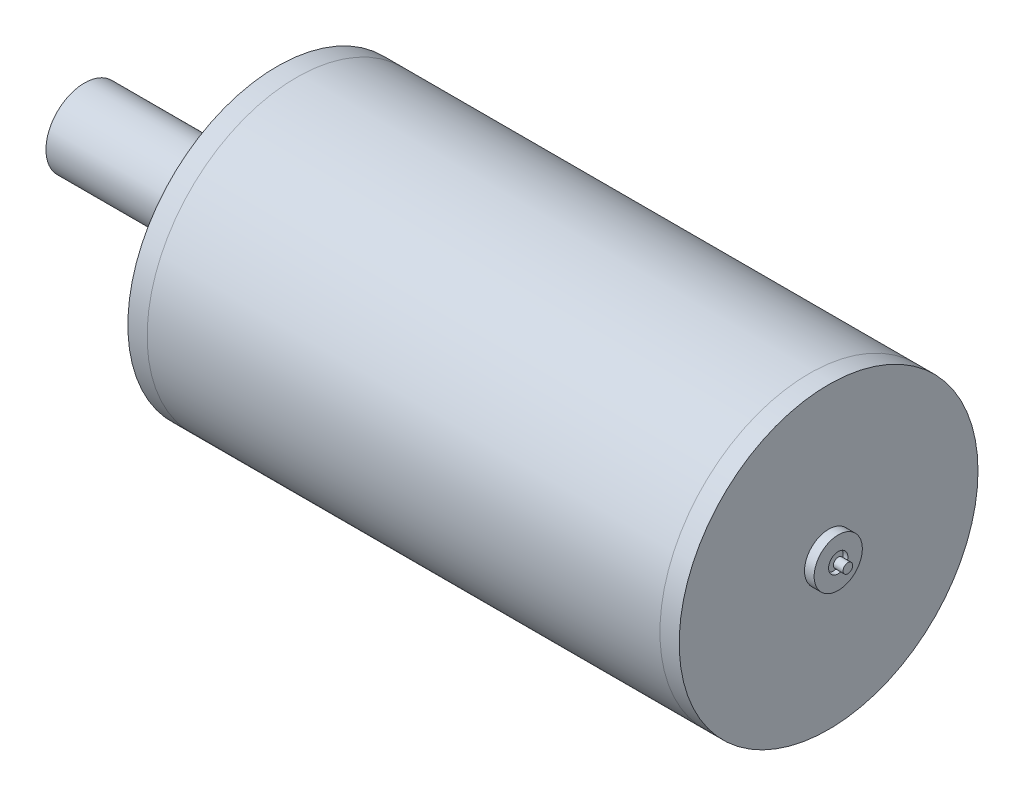
ISO-10303-21;
HEADER;
FILE_DESCRIPTION(('STEP AP214'),'2;1');
FILE_NAME('part.step','',(''),(''),'','','');
FILE_SCHEMA(('AUTOMOTIVE_DESIGN { 1 0 10303 214 1 1 1 1 }'));
ENDSEC;
DATA;
#1=APPLICATION_CONTEXT('core data for automotive mechanical design processes');
#2=APPLICATION_PROTOCOL_DEFINITION('international standard','automotive_design',2000,#1);
#3=PRODUCT_CONTEXT('',#1,'mechanical');
#4=PRODUCT('Part','Part','',(#3));
#5=PRODUCT_RELATED_PRODUCT_CATEGORY('part','',(#4));
#6=PRODUCT_DEFINITION_FORMATION('','',#4);
#7=PRODUCT_DEFINITION_CONTEXT('part definition',#1,'design');
#8=PRODUCT_DEFINITION('design','',#6,#7);
#9=PRODUCT_DEFINITION_SHAPE('','',#8);
#10=(LENGTH_UNIT() NAMED_UNIT(*) SI_UNIT(.MILLI.,.METRE.));
#11=(NAMED_UNIT(*) PLANE_ANGLE_UNIT() SI_UNIT($,.RADIAN.));
#12=(NAMED_UNIT(*) SI_UNIT($,.STERADIAN.) SOLID_ANGLE_UNIT());
#13=UNCERTAINTY_MEASURE_WITH_UNIT(LENGTH_MEASURE(1.E-05),#10,'distance_accuracy_value','');
#14=(GEOMETRIC_REPRESENTATION_CONTEXT(3) GLOBAL_UNCERTAINTY_ASSIGNED_CONTEXT((#13)) GLOBAL_UNIT_ASSIGNED_CONTEXT((#10,
#11,#12)) REPRESENTATION_CONTEXT('',''));
#15=CARTESIAN_POINT('',(0.,0.,0.));
#16=DIRECTION('',(0.,0.,1.));
#17=DIRECTION('',(1.,0.,0.));
#18=AXIS2_PLACEMENT_3D('',#15,#16,#17);
#19=CARTESIAN_POINT('',(59.2,0.,0.));
#20=DIRECTION('',(-1.,0.,0.));
#21=DIRECTION('',(0.,0.,1.));
#22=AXIS2_PLACEMENT_3D('',#19,#20,#21);
#23=CYLINDRICAL_SURFACE('',#22,0.5);
#24=CARTESIAN_POINT('',(59.2,0.,0.));
#25=DIRECTION('',(1.,0.,0.));
#26=DIRECTION('',(0.,0.,-1.));
#27=AXIS2_PLACEMENT_3D('',#24,#25,#26);
#28=CIRCLE('',#27,0.5);
#29=CARTESIAN_POINT('',(59.2,0.,-0.5));
#30=VERTEX_POINT('',#29);
#31=EDGE_CURVE('E11',#30,#30,#28,.T.);
#32=ORIENTED_EDGE('',*,*,#31,.F.);
#33=EDGE_LOOP('',(#32));
#34=FACE_BOUND('',#33,.T.);
#35=CARTESIAN_POINT('',(58.2,0.,0.));
#36=DIRECTION('',(1.,0.,0.));
#37=DIRECTION('',(0.,0.,-1.));
#38=AXIS2_PLACEMENT_3D('',#35,#36,#37);
#39=CIRCLE('',#38,0.5);
#40=CARTESIAN_POINT('',(58.2,0.,-0.5));
#41=VERTEX_POINT('',#40);
#42=EDGE_CURVE('E48',#41,#41,#39,.T.);
#43=ORIENTED_EDGE('',*,*,#42,.T.);
#44=EDGE_LOOP('',(#43));
#45=FACE_BOUND('',#44,.T.);
#46=ADVANCED_FACE('F45',(#34,#45),#23,.T.);
#47=CARTESIAN_POINT('',(59.2,0.,0.));
#48=DIRECTION('',(1.,0.,0.));
#49=DIRECTION('',(0.,0.,-1.));
#50=AXIS2_PLACEMENT_3D('',#47,#48,#49);
#51=PLANE('',#50);
#52=ORIENTED_EDGE('',*,*,#31,.T.);
#53=EDGE_LOOP('',(#52));
#54=FACE_BOUND('',#53,.T.);
#55=ADVANCED_FACE('F60',(#54),#51,.T.);
#56=CARTESIAN_POINT('',(58.2,0.,0.));
#57=DIRECTION('',(1.,0.,0.));
#58=DIRECTION('',(0.,0.,-1.));
#59=AXIS2_PLACEMENT_3D('',#56,#57,#58);
#60=PLANE('',#59);
#61=ORIENTED_EDGE('',*,*,#42,.F.);
#62=EDGE_LOOP('',(#61));
#63=FACE_BOUND('',#62,.T.);
#64=ADVANCED_FACE('F58',(#63),#60,.F.);
#65=CLOSED_SHELL('',(#46,#55,#64));
#66=MANIFOLD_SOLID_BREP('B2',#65);
#67=CARTESIAN_POINT('',(58.2,0.,0.));
#68=DIRECTION('',(-1.,0.,0.));
#69=DIRECTION('',(0.,0.,1.));
#70=AXIS2_PLACEMENT_3D('',#67,#68,#69);
#71=CYLINDRICAL_SURFACE('',#70,2.5);
#72=CARTESIAN_POINT('',(58.2,0.,0.));
#73=DIRECTION('',(1.,0.,0.));
#74=DIRECTION('',(0.,0.,-1.));
#75=AXIS2_PLACEMENT_3D('',#72,#73,#74);
#76=CIRCLE('',#75,2.5);
#77=CARTESIAN_POINT('',(58.2,0.,-2.5));
#78=VERTEX_POINT('',#77);
#79=EDGE_CURVE('E44',#78,#78,#76,.T.);
#80=ORIENTED_EDGE('',*,*,#79,.F.);
#81=EDGE_LOOP('',(#80));
#82=FACE_BOUND('',#81,.T.);
#83=CARTESIAN_POINT('',(57.2,0.,0.));
#84=DIRECTION('',(1.,0.,0.));
#85=DIRECTION('',(0.,0.,-1.));
#86=AXIS2_PLACEMENT_3D('',#83,#84,#85);
#87=CIRCLE('',#86,2.5);
#88=CARTESIAN_POINT('',(57.2,0.,-2.5));
#89=VERTEX_POINT('',#88);
#90=EDGE_CURVE('E96',#89,#89,#87,.T.);
#91=ORIENTED_EDGE('',*,*,#90,.T.);
#92=EDGE_LOOP('',(#91));
#93=FACE_BOUND('',#92,.T.);
#94=ADVANCED_FACE('F93',(#82,#93),#71,.T.);
#95=CARTESIAN_POINT('',(58.2,0.,0.));
#96=DIRECTION('',(1.,0.,0.));
#97=DIRECTION('',(0.,0.,-1.));
#98=AXIS2_PLACEMENT_3D('',#95,#96,#97);
#99=PLANE('',#98);
#100=CARTESIAN_POINT('',(58.2,0.,0.));
#101=DIRECTION('',(1.,0.,0.));
#102=DIRECTION('',(0.,0.,-1.));
#103=AXIS2_PLACEMENT_3D('',#100,#101,#102);
#104=CIRCLE('',#103,1.);
#105=CARTESIAN_POINT('',(58.2,0.,-1.));
#106=VERTEX_POINT('',#105);
#107=EDGE_CURVE('E105',#106,#106,#104,.T.);
#108=ORIENTED_EDGE('',*,*,#107,.F.);
#109=EDGE_LOOP('',(#108));
#110=FACE_BOUND('',#109,.T.);
#111=ORIENTED_EDGE('',*,*,#79,.T.);
#112=EDGE_LOOP('',(#111));
#113=FACE_BOUND('',#112,.T.);
#114=ADVANCED_FACE('F120',(#110,#113),#99,.T.);
#115=CARTESIAN_POINT('',(57.2,0.,0.));
#116=DIRECTION('',(1.,0.,0.));
#117=DIRECTION('',(0.,0.,-1.));
#118=AXIS2_PLACEMENT_3D('',#115,#116,#117);
#119=PLANE('',#118);
#120=ORIENTED_EDGE('',*,*,#90,.F.);
#121=EDGE_LOOP('',(#120));
#122=FACE_BOUND('',#121,.T.);
#123=ADVANCED_FACE('F116',(#122),#119,.F.);
#124=CARTESIAN_POINT('',(57.7,0.,0.));
#125=DIRECTION('',(1.,0.,0.));
#126=DIRECTION('',(0.,0.,-1.));
#127=AXIS2_PLACEMENT_3D('',#124,#125,#126);
#128=CYLINDRICAL_SURFACE('',#127,1.);
#129=CARTESIAN_POINT('',(57.7,0.,0.));
#130=DIRECTION('',(1.,0.,0.));
#131=DIRECTION('',(0.,0.,-1.));
#132=AXIS2_PLACEMENT_3D('',#129,#130,#131);
#133=CIRCLE('',#132,1.);
#134=CARTESIAN_POINT('',(57.7,0.,-1.));
#135=VERTEX_POINT('',#134);
#136=EDGE_CURVE('E103',#135,#135,#133,.T.);
#137=ORIENTED_EDGE('',*,*,#136,.F.);
#138=EDGE_LOOP('',(#137));
#139=FACE_BOUND('',#138,.T.);
#140=ORIENTED_EDGE('',*,*,#107,.T.);
#141=EDGE_LOOP('',(#140));
#142=FACE_BOUND('',#141,.T.);
#143=ADVANCED_FACE('F113',(#139,#142),#128,.F.);
#144=CARTESIAN_POINT('',(57.7,0.,0.));
#145=DIRECTION('',(1.,0.,0.));
#146=DIRECTION('',(0.,0.,-1.));
#147=AXIS2_PLACEMENT_3D('',#144,#145,#146);
#148=PLANE('',#147);
#149=ORIENTED_EDGE('',*,*,#136,.T.);
#150=EDGE_LOOP('',(#149));
#151=FACE_BOUND('',#150,.T.);
#152=ADVANCED_FACE('F111',(#151),#148,.T.);
#153=CLOSED_SHELL('',(#94,#114,#123,#143,#152));
#154=MANIFOLD_SOLID_BREP('B6',#153);
#155=CARTESIAN_POINT('',(57.2,0.,0.));
#156=DIRECTION('',(-1.,0.,0.));
#157=DIRECTION('',(0.,0.,1.));
#158=AXIS2_PLACEMENT_3D('',#155,#156,#157);
#159=CYLINDRICAL_SURFACE('',#158,15.5);
#160=CARTESIAN_POINT('',(57.2,0.,0.));
#161=DIRECTION('',(1.,0.,0.));
#162=DIRECTION('',(0.,0.,-1.));
#163=AXIS2_PLACEMENT_3D('',#160,#161,#162);
#164=CIRCLE('',#163,15.5);
#165=CARTESIAN_POINT('',(57.2,0.,-15.5));
#166=VERTEX_POINT('',#165);
#167=EDGE_CURVE('E92',#166,#166,#164,.T.);
#168=ORIENTED_EDGE('',*,*,#167,.F.);
#169=EDGE_LOOP('',(#168));
#170=FACE_BOUND('',#169,.T.);
#171=CARTESIAN_POINT('',(55.2,0.,0.));
#172=DIRECTION('',(1.,0.,0.));
#173=DIRECTION('',(0.,0.,-1.));
#174=AXIS2_PLACEMENT_3D('',#171,#172,#173);
#175=CIRCLE('',#174,15.5);
#176=CARTESIAN_POINT('',(55.2,0.,-15.5));
#177=VERTEX_POINT('',#176);
#178=EDGE_CURVE('E174',#177,#177,#175,.T.);
#179=ORIENTED_EDGE('',*,*,#178,.T.);
#180=EDGE_LOOP('',(#179));
#181=FACE_BOUND('',#180,.T.);
#182=ADVANCED_FACE('F171',(#170,#181),#159,.T.);
#183=CARTESIAN_POINT('',(57.2,0.,0.));
#184=DIRECTION('',(1.,0.,0.));
#185=DIRECTION('',(0.,0.,-1.));
#186=AXIS2_PLACEMENT_3D('',#183,#184,#185);
#187=PLANE('',#186);
#188=ORIENTED_EDGE('',*,*,#167,.T.);
#189=EDGE_LOOP('',(#188));
#190=FACE_BOUND('',#189,.T.);
#191=ADVANCED_FACE('F186',(#190),#187,.T.);
#192=CARTESIAN_POINT('',(55.2,0.,0.));
#193=DIRECTION('',(1.,0.,0.));
#194=DIRECTION('',(0.,0.,-1.));
#195=AXIS2_PLACEMENT_3D('',#192,#193,#194);
#196=PLANE('',#195);
#197=ORIENTED_EDGE('',*,*,#178,.F.);
#198=EDGE_LOOP('',(#197));
#199=FACE_BOUND('',#198,.T.);
#200=ADVANCED_FACE('F184',(#199),#196,.F.);
#201=CLOSED_SHELL('',(#182,#191,#200));
#202=MANIFOLD_SOLID_BREP('B39',#201);
#203=CARTESIAN_POINT('',(55.2,0.,0.));
#204=DIRECTION('',(-1.,0.,0.));
#205=DIRECTION('',(0.,0.,1.));
#206=AXIS2_PLACEMENT_3D('',#203,#204,#205);
#207=CYLINDRICAL_SURFACE('',#206,15.5);
#208=CARTESIAN_POINT('',(55.2,0.,0.));
#209=DIRECTION('',(1.,0.,0.));
#210=DIRECTION('',(0.,0.,-1.));
#211=AXIS2_PLACEMENT_3D('',#208,#209,#210);
#212=CIRCLE('',#211,15.5);
#213=CARTESIAN_POINT('',(55.2,0.,-15.5));
#214=VERTEX_POINT('',#213);
#215=EDGE_CURVE('E170',#214,#214,#212,.T.);
#216=ORIENTED_EDGE('',*,*,#215,.F.);
#217=EDGE_LOOP('',(#216));
#218=FACE_BOUND('',#217,.T.);
#219=CARTESIAN_POINT('',(2.,0.,0.));
#220=DIRECTION('',(1.,0.,0.));
#221=DIRECTION('',(0.,0.,-1.));
#222=AXIS2_PLACEMENT_3D('',#219,#220,#221);
#223=CIRCLE('',#222,15.5);
#224=CARTESIAN_POINT('',(2.,0.,-15.5));
#225=VERTEX_POINT('',#224);
#226=EDGE_CURVE('E221',#225,#225,#223,.T.);
#227=ORIENTED_EDGE('',*,*,#226,.T.);
#228=EDGE_LOOP('',(#227));
#229=FACE_BOUND('',#228,.T.);
#230=ADVANCED_FACE('F218',(#218,#229),#207,.T.);
#231=CARTESIAN_POINT('',(55.2,0.,0.));
#232=DIRECTION('',(1.,0.,0.));
#233=DIRECTION('',(0.,0.,-1.));
#234=AXIS2_PLACEMENT_3D('',#231,#232,#233);
#235=PLANE('',#234);
#236=ORIENTED_EDGE('',*,*,#215,.T.);
#237=EDGE_LOOP('',(#236));
#238=FACE_BOUND('',#237,.T.);
#239=ADVANCED_FACE('F233',(#238),#235,.T.);
#240=CARTESIAN_POINT('',(2.,0.,0.));
#241=DIRECTION('',(1.,0.,0.));
#242=DIRECTION('',(0.,0.,-1.));
#243=AXIS2_PLACEMENT_3D('',#240,#241,#242);
#244=PLANE('',#243);
#245=ORIENTED_EDGE('',*,*,#226,.F.);
#246=EDGE_LOOP('',(#245));
#247=FACE_BOUND('',#246,.T.);
#248=ADVANCED_FACE('F231',(#247),#244,.F.);
#249=CLOSED_SHELL('',(#230,#239,#248));
#250=MANIFOLD_SOLID_BREP('B87',#249);
#251=CARTESIAN_POINT('',(2.,0.,0.));
#252=DIRECTION('',(-1.,0.,0.));
#253=DIRECTION('',(0.,0.,1.));
#254=AXIS2_PLACEMENT_3D('',#251,#252,#253);
#255=CYLINDRICAL_SURFACE('',#254,15.5);
#256=CARTESIAN_POINT('',(2.,0.,0.));
#257=DIRECTION('',(1.,0.,0.));
#258=DIRECTION('',(0.,0.,-1.));
#259=AXIS2_PLACEMENT_3D('',#256,#257,#258);
#260=CIRCLE('',#259,15.5);
#261=CARTESIAN_POINT('',(2.,0.,-15.5));
#262=VERTEX_POINT('',#261);
#263=EDGE_CURVE('E217',#262,#262,#260,.T.);
#264=ORIENTED_EDGE('',*,*,#263,.F.);
#265=EDGE_LOOP('',(#264));
#266=FACE_BOUND('',#265,.T.);
#267=CARTESIAN_POINT('',(0.,0.,0.));
#268=DIRECTION('',(1.,0.,0.));
#269=DIRECTION('',(0.,0.,-1.));
#270=AXIS2_PLACEMENT_3D('',#267,#268,#269);
#271=CIRCLE('',#270,15.5);
#272=CARTESIAN_POINT('',(0.,0.,-15.5));
#273=VERTEX_POINT('',#272);
#274=EDGE_CURVE('E263',#273,#273,#271,.T.);
#275=ORIENTED_EDGE('',*,*,#274,.T.);
#276=EDGE_LOOP('',(#275));
#277=FACE_BOUND('',#276,.T.);
#278=ADVANCED_FACE('F260',(#266,#277),#255,.T.);
#279=CARTESIAN_POINT('',(2.,0.,0.));
#280=DIRECTION('',(1.,0.,0.));
#281=DIRECTION('',(0.,0.,-1.));
#282=AXIS2_PLACEMENT_3D('',#279,#280,#281);
#283=PLANE('',#282);
#284=ORIENTED_EDGE('',*,*,#263,.T.);
#285=EDGE_LOOP('',(#284));
#286=FACE_BOUND('',#285,.T.);
#287=ADVANCED_FACE('F290',(#286),#283,.T.);
#288=CARTESIAN_POINT('',(0.,0.,0.));
#289=DIRECTION('',(1.,0.,0.));
#290=DIRECTION('',(0.,0.,-1.));
#291=AXIS2_PLACEMENT_3D('',#288,#289,#290);
#292=PLANE('',#291);
#293=CARTESIAN_POINT('',(0.,0.,0.));
#294=DIRECTION('',(1.,0.,0.));
#295=DIRECTION('',(0.,0.,-1.));
#296=AXIS2_PLACEMENT_3D('',#293,#294,#295);
#297=CIRCLE('',#296,4.);
#298=CARTESIAN_POINT('',(0.,0.,-4.));
#299=VERTEX_POINT('',#298);
#300=EDGE_CURVE('E272',#299,#299,#297,.T.);
#301=ORIENTED_EDGE('',*,*,#300,.T.);
#302=EDGE_LOOP('',(#301));
#303=FACE_BOUND('',#302,.T.);
#304=ORIENTED_EDGE('',*,*,#274,.F.);
#305=EDGE_LOOP('',(#304));
#306=FACE_BOUND('',#305,.T.);
#307=ADVANCED_FACE('F287',(#303,#306),#292,.F.);
#308=CARTESIAN_POINT('',(-20.,0.,0.));
#309=DIRECTION('',(1.,0.,0.));
#310=DIRECTION('',(0.,0.,-1.));
#311=AXIS2_PLACEMENT_3D('',#308,#309,#310);
#312=CYLINDRICAL_SURFACE('',#311,4.);
#313=CARTESIAN_POINT('',(-20.,0.,0.));
#314=DIRECTION('',(1.,0.,0.));
#315=DIRECTION('',(0.,0.,-1.));
#316=AXIS2_PLACEMENT_3D('',#313,#314,#315);
#317=CIRCLE('',#316,4.);
#318=CARTESIAN_POINT('',(-20.,0.,-4.));
#319=VERTEX_POINT('',#318);
#320=EDGE_CURVE('E270',#319,#319,#317,.T.);
#321=ORIENTED_EDGE('',*,*,#320,.T.);
#322=EDGE_LOOP('',(#321));
#323=FACE_BOUND('',#322,.T.);
#324=ORIENTED_EDGE('',*,*,#300,.F.);
#325=EDGE_LOOP('',(#324));
#326=FACE_BOUND('',#325,.T.);
#327=ADVANCED_FACE('F278',(#323,#326),#312,.T.);
#328=CARTESIAN_POINT('',(-20.,0.,0.));
#329=DIRECTION('',(1.,0.,0.));
#330=DIRECTION('',(0.,0.,-1.));
#331=AXIS2_PLACEMENT_3D('',#328,#329,#330);
#332=PLANE('',#331);
#333=ORIENTED_EDGE('',*,*,#320,.F.);
#334=EDGE_LOOP('',(#333));
#335=FACE_BOUND('',#334,.T.);
#336=ADVANCED_FACE('F281',(#335),#332,.F.);
#337=CLOSED_SHELL('',(#278,#287,#307,#327,#336));
#338=MANIFOLD_SOLID_BREP('B165',#337);
#339=ADVANCED_BREP_SHAPE_REPRESENTATION('',(#18,#66,#154,#202,#250,#338),#14);
#340=SHAPE_DEFINITION_REPRESENTATION(#9,#339);
ENDSEC;
END-ISO-10303-21;
